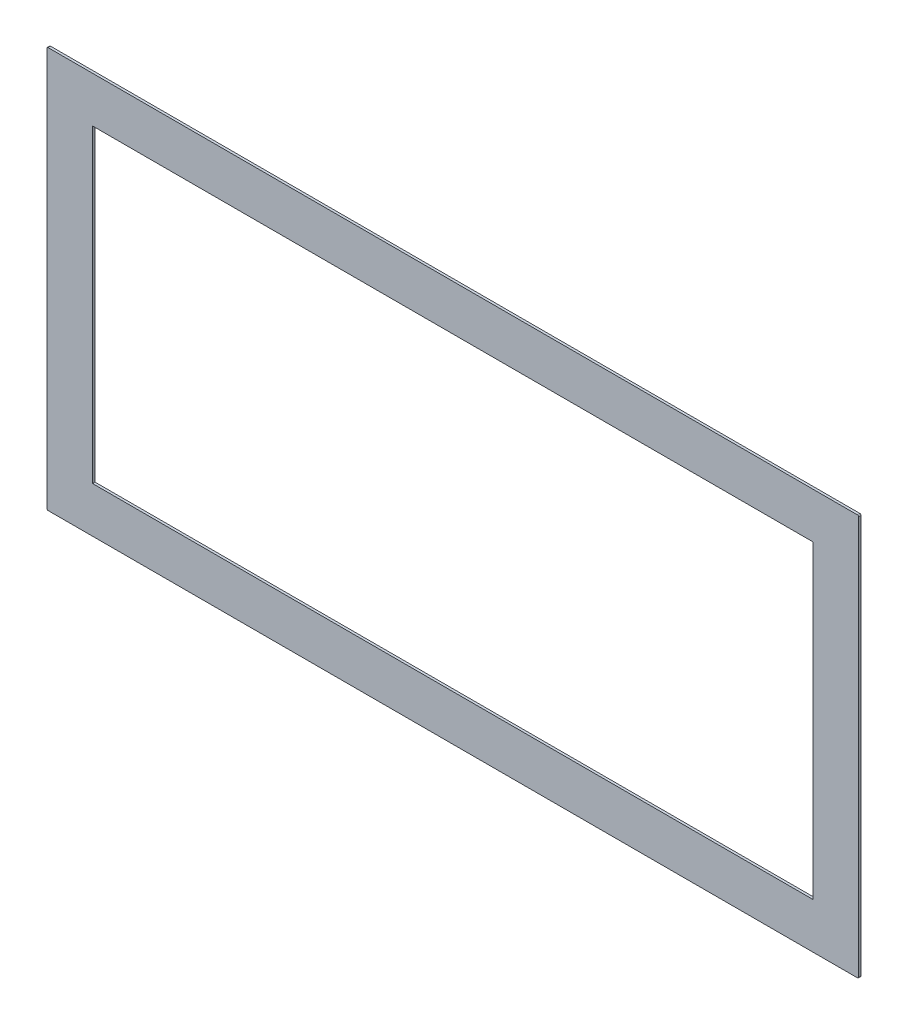
ISO-10303-21;
HEADER;
FILE_DESCRIPTION(('STEP AP214'),'2;1');
FILE_NAME('part.step','',(''),(''),'','','');
FILE_SCHEMA(('AUTOMOTIVE_DESIGN { 1 0 10303 214 1 1 1 1 }'));
ENDSEC;
DATA;
#1=APPLICATION_CONTEXT('core data for automotive mechanical design processes');
#2=APPLICATION_PROTOCOL_DEFINITION('international standard','automotive_design',2000,#1);
#3=PRODUCT_CONTEXT('',#1,'mechanical');
#4=PRODUCT('Part','Part','',(#3));
#5=PRODUCT_RELATED_PRODUCT_CATEGORY('part','',(#4));
#6=PRODUCT_DEFINITION_FORMATION('','',#4);
#7=PRODUCT_DEFINITION_CONTEXT('part definition',#1,'design');
#8=PRODUCT_DEFINITION('design','',#6,#7);
#9=PRODUCT_DEFINITION_SHAPE('','',#8);
#10=(LENGTH_UNIT() NAMED_UNIT(*) SI_UNIT(.MILLI.,.METRE.));
#11=(NAMED_UNIT(*) PLANE_ANGLE_UNIT() SI_UNIT($,.RADIAN.));
#12=(NAMED_UNIT(*) SI_UNIT($,.STERADIAN.) SOLID_ANGLE_UNIT());
#13=UNCERTAINTY_MEASURE_WITH_UNIT(LENGTH_MEASURE(1.E-05),#10,'distance_accuracy_value','');
#14=(GEOMETRIC_REPRESENTATION_CONTEXT(3) GLOBAL_UNCERTAINTY_ASSIGNED_CONTEXT((#13)) GLOBAL_UNIT_ASSIGNED_CONTEXT((#10,
#11,#12)) REPRESENTATION_CONTEXT('',''));
#15=CARTESIAN_POINT('',(0.,0.,0.));
#16=DIRECTION('',(0.,0.,1.));
#17=DIRECTION('',(1.,0.,0.));
#18=AXIS2_PLACEMENT_3D('',#15,#16,#17);
#19=CARTESIAN_POINT('',(-328.5,0.5,1.));
#20=DIRECTION('',(0.,0.,1.));
#21=DIRECTION('',(1.,0.,0.));
#22=AXIS2_PLACEMENT_3D('',#19,#20,#21);
#23=PLANE('',#22);
#24=CARTESIAN_POINT('',(-328.5,0.5,1.));
#25=DIRECTION('',(0.,0.,1.));
#26=DIRECTION('',(1.,0.,0.));
#27=AXIS2_PLACEMENT_3D('',#24,#25,#26);
#28=CIRCLE('',#27,0.500000000000028);
#29=CARTESIAN_POINT('',(-329.,0.5,1.));
#30=VERTEX_POINT('',#29);
#31=CARTESIAN_POINT('',(-328.5,0.,1.));
#32=VERTEX_POINT('',#31);
#33=EDGE_CURVE('E177',#30,#32,#28,.T.);
#34=ORIENTED_EDGE('',*,*,#33,.T.);
#35=DIRECTION('',(1.,0.,0.));
#36=VECTOR('',#35,1.);
#37=CARTESIAN_POINT('',(-328.5,0.,1.));
#38=LINE('',#37,#36);
#39=CARTESIAN_POINT('',(-0.500000000000004,0.,1.));
#40=VERTEX_POINT('',#39);
#41=EDGE_CURVE('E181',#32,#40,#38,.T.);
#42=ORIENTED_EDGE('',*,*,#41,.T.);
#43=CARTESIAN_POINT('',(-0.5,0.5,1.));
#44=DIRECTION('',(0.,0.,1.));
#45=DIRECTION('',(1.,0.,0.));
#46=AXIS2_PLACEMENT_3D('',#43,#44,#45);
#47=CIRCLE('',#46,0.5);
#48=CARTESIAN_POINT('',(0.,0.500000000000004,1.));
#49=VERTEX_POINT('',#48);
#50=EDGE_CURVE('E185',#40,#49,#47,.T.);
#51=ORIENTED_EDGE('',*,*,#50,.T.);
#52=DIRECTION('',(0.,1.,0.));
#53=VECTOR('',#52,1.);
#54=CARTESIAN_POINT('',(1.79110198894605E-13,162.,1.));
#55=LINE('',#54,#53);
#56=CARTESIAN_POINT('',(1.4506625067856E-13,162.,1.));
#57=VERTEX_POINT('',#56);
#58=EDGE_CURVE('E188',#49,#57,#55,.T.);
#59=ORIENTED_EDGE('',*,*,#58,.T.);
#60=CARTESIAN_POINT('',(-0.499999999999834,162.,1.));
#61=DIRECTION('',(0.,0.,1.));
#62=DIRECTION('',(-1.,0.,0.));
#63=AXIS2_PLACEMENT_3D('',#60,#61,#62);
#64=CIRCLE('',#63,0.499999999999979);
#65=CARTESIAN_POINT('',(-0.499999999999834,162.5,1.));
#66=VERTEX_POINT('',#65);
#67=EDGE_CURVE('E191',#57,#66,#64,.T.);
#68=ORIENTED_EDGE('',*,*,#67,.T.);
#69=DIRECTION('',(-1.,0.,0.));
#70=VECTOR('',#69,1.);
#71=CARTESIAN_POINT('',(-328.5,162.5,1.));
#72=LINE('',#71,#70);
#73=CARTESIAN_POINT('',(-328.5,162.5,1.));
#74=VERTEX_POINT('',#73);
#75=EDGE_CURVE('E194',#66,#74,#72,.T.);
#76=ORIENTED_EDGE('',*,*,#75,.T.);
#77=CARTESIAN_POINT('',(-328.5,162.,1.));
#78=DIRECTION('',(0.,0.,1.));
#79=DIRECTION('',(1.,0.,0.));
#80=AXIS2_PLACEMENT_3D('',#77,#78,#79);
#81=CIRCLE('',#80,0.499999999999973);
#82=CARTESIAN_POINT('',(-329.,162.,1.));
#83=VERTEX_POINT('',#82);
#84=EDGE_CURVE('E197',#74,#83,#81,.T.);
#85=ORIENTED_EDGE('',*,*,#84,.T.);
#86=DIRECTION('',(0.,-1.,0.));
#87=VECTOR('',#86,1.);
#88=CARTESIAN_POINT('',(-329.,162.,1.));
#89=LINE('',#88,#87);
#90=EDGE_CURVE('E200',#83,#30,#89,.T.);
#91=ORIENTED_EDGE('',*,*,#90,.T.);
#92=EDGE_LOOP('',(#34,#42,#51,#59,#68,#76,#85,#91));
#93=FACE_BOUND('',#92,.T.);
#94=DIRECTION('',(1.,0.,0.));
#95=VECTOR('',#94,1.);
#96=CARTESIAN_POINT('',(-310.5,18.5,1.));
#97=LINE('',#96,#95);
#98=CARTESIAN_POINT('',(-310.5,18.5,1.));
#99=VERTEX_POINT('',#98);
#100=CARTESIAN_POINT('',(-18.5,18.5,1.));
#101=VERTEX_POINT('',#100);
#102=EDGE_CURVE('E138',#99,#101,#97,.T.);
#103=ORIENTED_EDGE('',*,*,#102,.F.);
#104=DIRECTION('',(0.,-1.,0.));
#105=VECTOR('',#104,1.);
#106=CARTESIAN_POINT('',(-310.5,144.,1.));
#107=LINE('',#106,#105);
#108=CARTESIAN_POINT('',(-310.5,144.,1.));
#109=VERTEX_POINT('',#108);
#110=EDGE_CURVE('E129',#109,#99,#107,.T.);
#111=ORIENTED_EDGE('',*,*,#110,.F.);
#112=DIRECTION('',(-1.,0.,0.));
#113=VECTOR('',#112,1.);
#114=CARTESIAN_POINT('',(-310.5,144.,1.));
#115=LINE('',#114,#113);
#116=CARTESIAN_POINT('',(-18.5,144.,1.));
#117=VERTEX_POINT('',#116);
#118=EDGE_CURVE('E155',#117,#109,#115,.T.);
#119=ORIENTED_EDGE('',*,*,#118,.F.);
#120=DIRECTION('',(0.,1.,0.));
#121=VECTOR('',#120,1.);
#122=CARTESIAN_POINT('',(-18.5,144.,1.));
#123=LINE('',#122,#121);
#124=EDGE_CURVE('E151',#101,#117,#123,.T.);
#125=ORIENTED_EDGE('',*,*,#124,.F.);
#126=EDGE_LOOP('',(#103,#111,#119,#125));
#127=FACE_BOUND('',#126,.T.);
#128=ADVANCED_FACE('F39',(#93,#127),#23,.T.);
#129=CARTESIAN_POINT('',(-328.5,0.5,0.));
#130=DIRECTION('',(0.,0.,1.));
#131=DIRECTION('',(1.,0.,0.));
#132=AXIS2_PLACEMENT_3D('',#129,#130,#131);
#133=PLANE('',#132);
#134=CARTESIAN_POINT('',(-328.5,0.5,0.));
#135=DIRECTION('',(0.,0.,1.));
#136=DIRECTION('',(1.,0.,0.));
#137=AXIS2_PLACEMENT_3D('',#134,#135,#136);
#138=CIRCLE('',#137,0.500000000000028);
#139=CARTESIAN_POINT('',(-329.,0.5,0.));
#140=VERTEX_POINT('',#139);
#141=CARTESIAN_POINT('',(-328.5,0.,0.));
#142=VERTEX_POINT('',#141);
#143=EDGE_CURVE('E147',#140,#142,#138,.T.);
#144=ORIENTED_EDGE('',*,*,#143,.F.);
#145=DIRECTION('',(0.,-1.,0.));
#146=VECTOR('',#145,1.);
#147=CARTESIAN_POINT('',(-329.,162.,0.));
#148=LINE('',#147,#146);
#149=CARTESIAN_POINT('',(-329.,162.,0.));
#150=VERTEX_POINT('',#149);
#151=EDGE_CURVE('E182',#150,#140,#148,.T.);
#152=ORIENTED_EDGE('',*,*,#151,.F.);
#153=CARTESIAN_POINT('',(-328.5,162.,0.));
#154=DIRECTION('',(0.,0.,1.));
#155=DIRECTION('',(1.,0.,0.));
#156=AXIS2_PLACEMENT_3D('',#153,#154,#155);
#157=CIRCLE('',#156,0.499999999999973);
#158=CARTESIAN_POINT('',(-328.5,162.5,0.));
#159=VERTEX_POINT('',#158);
#160=EDGE_CURVE('E222',#159,#150,#157,.T.);
#161=ORIENTED_EDGE('',*,*,#160,.F.);
#162=DIRECTION('',(-1.,0.,0.));
#163=VECTOR('',#162,1.);
#164=CARTESIAN_POINT('',(-328.5,162.5,0.));
#165=LINE('',#164,#163);
#166=CARTESIAN_POINT('',(-0.499999999999834,162.5,0.));
#167=VERTEX_POINT('',#166);
#168=EDGE_CURVE('E219',#167,#159,#165,.T.);
#169=ORIENTED_EDGE('',*,*,#168,.F.);
#170=CARTESIAN_POINT('',(-0.499999999999834,162.,0.));
#171=DIRECTION('',(0.,0.,1.));
#172=DIRECTION('',(-1.,0.,0.));
#173=AXIS2_PLACEMENT_3D('',#170,#171,#172);
#174=CIRCLE('',#173,0.499999999999979);
#175=CARTESIAN_POINT('',(1.4506625067856E-13,162.,0.));
#176=VERTEX_POINT('',#175);
#177=EDGE_CURVE('E216',#176,#167,#174,.T.);
#178=ORIENTED_EDGE('',*,*,#177,.F.);
#179=DIRECTION('',(0.,1.,0.));
#180=VECTOR('',#179,1.);
#181=CARTESIAN_POINT('',(1.79110198894605E-13,162.,0.));
#182=LINE('',#181,#180);
#183=CARTESIAN_POINT('',(0.,0.500000000000004,0.));
#184=VERTEX_POINT('',#183);
#185=EDGE_CURVE('E213',#184,#176,#182,.T.);
#186=ORIENTED_EDGE('',*,*,#185,.F.);
#187=CARTESIAN_POINT('',(-0.5,0.5,0.));
#188=DIRECTION('',(0.,0.,1.));
#189=DIRECTION('',(1.,0.,0.));
#190=AXIS2_PLACEMENT_3D('',#187,#188,#189);
#191=CIRCLE('',#190,0.5);
#192=CARTESIAN_POINT('',(-0.500000000000004,0.,0.));
#193=VERTEX_POINT('',#192);
#194=EDGE_CURVE('E210',#193,#184,#191,.T.);
#195=ORIENTED_EDGE('',*,*,#194,.F.);
#196=DIRECTION('',(1.,0.,0.));
#197=VECTOR('',#196,1.);
#198=CARTESIAN_POINT('',(-328.5,0.,0.));
#199=LINE('',#198,#197);
#200=EDGE_CURVE('E207',#142,#193,#199,.T.);
#201=ORIENTED_EDGE('',*,*,#200,.F.);
#202=EDGE_LOOP('',(#144,#152,#161,#169,#178,#186,#195,#201));
#203=FACE_BOUND('',#202,.T.);
#204=DIRECTION('',(0.,-1.,0.));
#205=VECTOR('',#204,1.);
#206=CARTESIAN_POINT('',(-310.5,144.,0.));
#207=LINE('',#206,#205);
#208=CARTESIAN_POINT('',(-310.5,144.,0.));
#209=VERTEX_POINT('',#208);
#210=CARTESIAN_POINT('',(-310.5,18.5,0.));
#211=VERTEX_POINT('',#210);
#212=EDGE_CURVE('E63',#209,#211,#207,.T.);
#213=ORIENTED_EDGE('',*,*,#212,.T.);
#214=DIRECTION('',(1.,0.,0.));
#215=VECTOR('',#214,1.);
#216=CARTESIAN_POINT('',(-310.5,18.5,0.));
#217=LINE('',#216,#215);
#218=CARTESIAN_POINT('',(-18.5,18.5,0.));
#219=VERTEX_POINT('',#218);
#220=EDGE_CURVE('E145',#211,#219,#217,.T.);
#221=ORIENTED_EDGE('',*,*,#220,.T.);
#222=DIRECTION('',(0.,1.,0.));
#223=VECTOR('',#222,1.);
#224=CARTESIAN_POINT('',(-18.5,144.,0.));
#225=LINE('',#224,#223);
#226=CARTESIAN_POINT('',(-18.5,144.,0.));
#227=VERTEX_POINT('',#226);
#228=EDGE_CURVE('E164',#219,#227,#225,.T.);
#229=ORIENTED_EDGE('',*,*,#228,.T.);
#230=DIRECTION('',(-1.,0.,0.));
#231=VECTOR('',#230,1.);
#232=CARTESIAN_POINT('',(-310.5,144.,0.));
#233=LINE('',#232,#231);
#234=EDGE_CURVE('E139',#227,#209,#233,.T.);
#235=ORIENTED_EDGE('',*,*,#234,.T.);
#236=EDGE_LOOP('',(#213,#221,#229,#235));
#237=FACE_BOUND('',#236,.T.);
#238=ADVANCED_FACE('F261',(#203,#237),#133,.F.);
#239=CARTESIAN_POINT('',(-328.5,0.5,1.));
#240=DIRECTION('',(0.,0.,-1.));
#241=DIRECTION('',(-1.,0.,0.));
#242=AXIS2_PLACEMENT_3D('',#239,#240,#241);
#243=CYLINDRICAL_SURFACE('',#242,0.500000000000028);
#244=ORIENTED_EDGE('',*,*,#143,.T.);
#245=DIRECTION('',(0.,0.,-1.));
#246=VECTOR('',#245,1.);
#247=CARTESIAN_POINT('',(-328.5,0.,1.));
#248=LINE('',#247,#246);
#249=EDGE_CURVE('E11',#32,#142,#248,.T.);
#250=ORIENTED_EDGE('',*,*,#249,.F.);
#251=ORIENTED_EDGE('',*,*,#33,.F.);
#252=DIRECTION('',(0.,0.,-1.));
#253=VECTOR('',#252,1.);
#254=CARTESIAN_POINT('',(-329.,0.5,1.));
#255=LINE('',#254,#253);
#256=EDGE_CURVE('E203',#30,#140,#255,.T.);
#257=ORIENTED_EDGE('',*,*,#256,.T.);
#258=EDGE_LOOP('',(#244,#250,#251,#257));
#259=FACE_BOUND('',#258,.T.);
#260=ADVANCED_FACE('F41',(#259),#243,.T.);
#261=CARTESIAN_POINT('',(-328.5,0.,1.));
#262=DIRECTION('',(0.,1.,0.));
#263=DIRECTION('',(0.,0.,1.));
#264=AXIS2_PLACEMENT_3D('',#261,#262,#263);
#265=PLANE('',#264);
#266=ORIENTED_EDGE('',*,*,#200,.T.);
#267=DIRECTION('',(0.,0.,-1.));
#268=VECTOR('',#267,1.);
#269=CARTESIAN_POINT('',(-0.500000000000004,0.,1.));
#270=LINE('',#269,#268);
#271=EDGE_CURVE('E48',#40,#193,#270,.T.);
#272=ORIENTED_EDGE('',*,*,#271,.F.);
#273=ORIENTED_EDGE('',*,*,#41,.F.);
#274=ORIENTED_EDGE('',*,*,#249,.T.);
#275=EDGE_LOOP('',(#266,#272,#273,#274));
#276=FACE_BOUND('',#275,.T.);
#277=ADVANCED_FACE('F278',(#276),#265,.F.);
#278=CARTESIAN_POINT('',(-0.5,0.5,1.));
#279=DIRECTION('',(0.,0.,-1.));
#280=DIRECTION('',(-1.,0.,0.));
#281=AXIS2_PLACEMENT_3D('',#278,#279,#280);
#282=CYLINDRICAL_SURFACE('',#281,0.5);
#283=ORIENTED_EDGE('',*,*,#194,.T.);
#284=DIRECTION('',(0.,0.,-1.));
#285=VECTOR('',#284,1.);
#286=CARTESIAN_POINT('',(0.,0.500000000000004,1.));
#287=LINE('',#286,#285);
#288=EDGE_CURVE('E246',#49,#184,#287,.T.);
#289=ORIENTED_EDGE('',*,*,#288,.F.);
#290=ORIENTED_EDGE('',*,*,#50,.F.);
#291=ORIENTED_EDGE('',*,*,#271,.T.);
#292=EDGE_LOOP('',(#283,#289,#290,#291));
#293=FACE_BOUND('',#292,.T.);
#294=ADVANCED_FACE('F255',(#293),#282,.T.);
#295=CARTESIAN_POINT('',(1.79110198894605E-13,162.,1.));
#296=DIRECTION('',(-1.,0.,0.));
#297=DIRECTION('',(0.,-1.,0.));
#298=AXIS2_PLACEMENT_3D('',#295,#296,#297);
#299=PLANE('',#298);
#300=ORIENTED_EDGE('',*,*,#185,.T.);
#301=DIRECTION('',(0.,0.,-1.));
#302=VECTOR('',#301,1.);
#303=CARTESIAN_POINT('',(1.4506625067856E-13,162.,1.));
#304=LINE('',#303,#302);
#305=EDGE_CURVE('E242',#57,#176,#304,.T.);
#306=ORIENTED_EDGE('',*,*,#305,.F.);
#307=ORIENTED_EDGE('',*,*,#58,.F.);
#308=ORIENTED_EDGE('',*,*,#288,.T.);
#309=EDGE_LOOP('',(#300,#306,#307,#308));
#310=FACE_BOUND('',#309,.T.);
#311=ADVANCED_FACE('F267',(#310),#299,.F.);
#312=CARTESIAN_POINT('',(-0.499999999999834,162.,1.));
#313=DIRECTION('',(0.,0.,-1.));
#314=DIRECTION('',(-1.,0.,0.));
#315=AXIS2_PLACEMENT_3D('',#312,#313,#314);
#316=CYLINDRICAL_SURFACE('',#315,0.499999999999979);
#317=ORIENTED_EDGE('',*,*,#177,.T.);
#318=DIRECTION('',(0.,0.,-1.));
#319=VECTOR('',#318,1.);
#320=CARTESIAN_POINT('',(-0.499999999999834,162.5,1.));
#321=LINE('',#320,#319);
#322=EDGE_CURVE('E238',#66,#167,#321,.T.);
#323=ORIENTED_EDGE('',*,*,#322,.F.);
#324=ORIENTED_EDGE('',*,*,#67,.F.);
#325=ORIENTED_EDGE('',*,*,#305,.T.);
#326=EDGE_LOOP('',(#317,#323,#324,#325));
#327=FACE_BOUND('',#326,.T.);
#328=ADVANCED_FACE('F271',(#327),#316,.T.);
#329=CARTESIAN_POINT('',(-328.5,162.5,1.));
#330=DIRECTION('',(0.,-1.,0.));
#331=DIRECTION('',(0.,0.,-1.));
#332=AXIS2_PLACEMENT_3D('',#329,#330,#331);
#333=PLANE('',#332);
#334=ORIENTED_EDGE('',*,*,#168,.T.);
#335=DIRECTION('',(0.,0.,-1.));
#336=VECTOR('',#335,1.);
#337=CARTESIAN_POINT('',(-328.5,162.5,1.));
#338=LINE('',#337,#336);
#339=EDGE_CURVE('E234',#74,#159,#338,.T.);
#340=ORIENTED_EDGE('',*,*,#339,.F.);
#341=ORIENTED_EDGE('',*,*,#75,.F.);
#342=ORIENTED_EDGE('',*,*,#322,.T.);
#343=EDGE_LOOP('',(#334,#340,#341,#342));
#344=FACE_BOUND('',#343,.T.);
#345=ADVANCED_FACE('F291',(#344),#333,.F.);
#346=CARTESIAN_POINT('',(-328.5,162.,1.));
#347=DIRECTION('',(0.,0.,-1.));
#348=DIRECTION('',(-1.,0.,0.));
#349=AXIS2_PLACEMENT_3D('',#346,#347,#348);
#350=CYLINDRICAL_SURFACE('',#349,0.499999999999973);
#351=ORIENTED_EDGE('',*,*,#160,.T.);
#352=DIRECTION('',(0.,0.,-1.));
#353=VECTOR('',#352,1.);
#354=CARTESIAN_POINT('',(-329.,162.,1.));
#355=LINE('',#354,#353);
#356=EDGE_CURVE('E230',#83,#150,#355,.T.);
#357=ORIENTED_EDGE('',*,*,#356,.F.);
#358=ORIENTED_EDGE('',*,*,#84,.F.);
#359=ORIENTED_EDGE('',*,*,#339,.T.);
#360=EDGE_LOOP('',(#351,#357,#358,#359));
#361=FACE_BOUND('',#360,.T.);
#362=ADVANCED_FACE('F289',(#361),#350,.T.);
#363=CARTESIAN_POINT('',(-329.,162.,1.));
#364=DIRECTION('',(1.,0.,0.));
#365=DIRECTION('',(0.,1.,0.));
#366=AXIS2_PLACEMENT_3D('',#363,#364,#365);
#367=PLANE('',#366);
#368=ORIENTED_EDGE('',*,*,#151,.T.);
#369=ORIENTED_EDGE('',*,*,#256,.F.);
#370=ORIENTED_EDGE('',*,*,#90,.F.);
#371=ORIENTED_EDGE('',*,*,#356,.T.);
#372=EDGE_LOOP('',(#368,#369,#370,#371));
#373=FACE_BOUND('',#372,.T.);
#374=ADVANCED_FACE('F284',(#373),#367,.F.);
#375=CARTESIAN_POINT('',(-310.5,144.,1.));
#376=DIRECTION('',(1.,0.,0.));
#377=DIRECTION('',(0.,0.,-1.));
#378=AXIS2_PLACEMENT_3D('',#375,#376,#377);
#379=PLANE('',#378);
#380=ORIENTED_EDGE('',*,*,#212,.F.);
#381=DIRECTION('',(0.,0.,-1.));
#382=VECTOR('',#381,1.);
#383=CARTESIAN_POINT('',(-310.5,144.,1.));
#384=LINE('',#383,#382);
#385=EDGE_CURVE('E133',#109,#209,#384,.T.);
#386=ORIENTED_EDGE('',*,*,#385,.F.);
#387=ORIENTED_EDGE('',*,*,#110,.T.);
#388=DIRECTION('',(0.,0.,-1.));
#389=VECTOR('',#388,1.);
#390=CARTESIAN_POINT('',(-310.5,18.5,1.));
#391=LINE('',#390,#389);
#392=EDGE_CURVE('E132',#99,#211,#391,.T.);
#393=ORIENTED_EDGE('',*,*,#392,.T.);
#394=EDGE_LOOP('',(#380,#386,#387,#393));
#395=FACE_BOUND('',#394,.T.);
#396=ADVANCED_FACE('F131',(#395),#379,.T.);
#397=CARTESIAN_POINT('',(-310.5,18.5,1.));
#398=DIRECTION('',(0.,1.,0.));
#399=DIRECTION('',(0.,0.,1.));
#400=AXIS2_PLACEMENT_3D('',#397,#398,#399);
#401=PLANE('',#400);
#402=ORIENTED_EDGE('',*,*,#220,.F.);
#403=ORIENTED_EDGE('',*,*,#392,.F.);
#404=ORIENTED_EDGE('',*,*,#102,.T.);
#405=DIRECTION('',(0.,0.,-1.));
#406=VECTOR('',#405,1.);
#407=CARTESIAN_POINT('',(-18.5,18.5,1.));
#408=LINE('',#407,#406);
#409=EDGE_CURVE('E148',#101,#219,#408,.T.);
#410=ORIENTED_EDGE('',*,*,#409,.T.);
#411=EDGE_LOOP('',(#402,#403,#404,#410));
#412=FACE_BOUND('',#411,.T.);
#413=ADVANCED_FACE('F142',(#412),#401,.T.);
#414=CARTESIAN_POINT('',(-18.5,144.,1.));
#415=DIRECTION('',(-1.,0.,0.));
#416=DIRECTION('',(0.,0.,1.));
#417=AXIS2_PLACEMENT_3D('',#414,#415,#416);
#418=PLANE('',#417);
#419=ORIENTED_EDGE('',*,*,#228,.F.);
#420=ORIENTED_EDGE('',*,*,#409,.F.);
#421=ORIENTED_EDGE('',*,*,#124,.T.);
#422=DIRECTION('',(0.,0.,-1.));
#423=VECTOR('',#422,1.);
#424=CARTESIAN_POINT('',(-18.5,144.,1.));
#425=LINE('',#424,#423);
#426=EDGE_CURVE('E55',#117,#227,#425,.T.);
#427=ORIENTED_EDGE('',*,*,#426,.T.);
#428=EDGE_LOOP('',(#419,#420,#421,#427));
#429=FACE_BOUND('',#428,.T.);
#430=ADVANCED_FACE('F316',(#429),#418,.T.);
#431=CARTESIAN_POINT('',(-310.5,144.,1.));
#432=DIRECTION('',(0.,-1.,0.));
#433=DIRECTION('',(0.,0.,-1.));
#434=AXIS2_PLACEMENT_3D('',#431,#432,#433);
#435=PLANE('',#434);
#436=ORIENTED_EDGE('',*,*,#234,.F.);
#437=ORIENTED_EDGE('',*,*,#426,.F.);
#438=ORIENTED_EDGE('',*,*,#118,.T.);
#439=ORIENTED_EDGE('',*,*,#385,.T.);
#440=EDGE_LOOP('',(#436,#437,#438,#439));
#441=FACE_BOUND('',#440,.T.);
#442=ADVANCED_FACE('F320',(#441),#435,.T.);
#443=CLOSED_SHELL('',(#128,#238,#260,#277,#294,#311,#328,#345,#362,#374,#396,#413,#430,#442));
#444=MANIFOLD_SOLID_BREP('B2',#443);
#445=ADVANCED_BREP_SHAPE_REPRESENTATION('',(#18,#444),#14);
#446=SHAPE_DEFINITION_REPRESENTATION(#9,#445);
ENDSEC;
END-ISO-10303-21;
